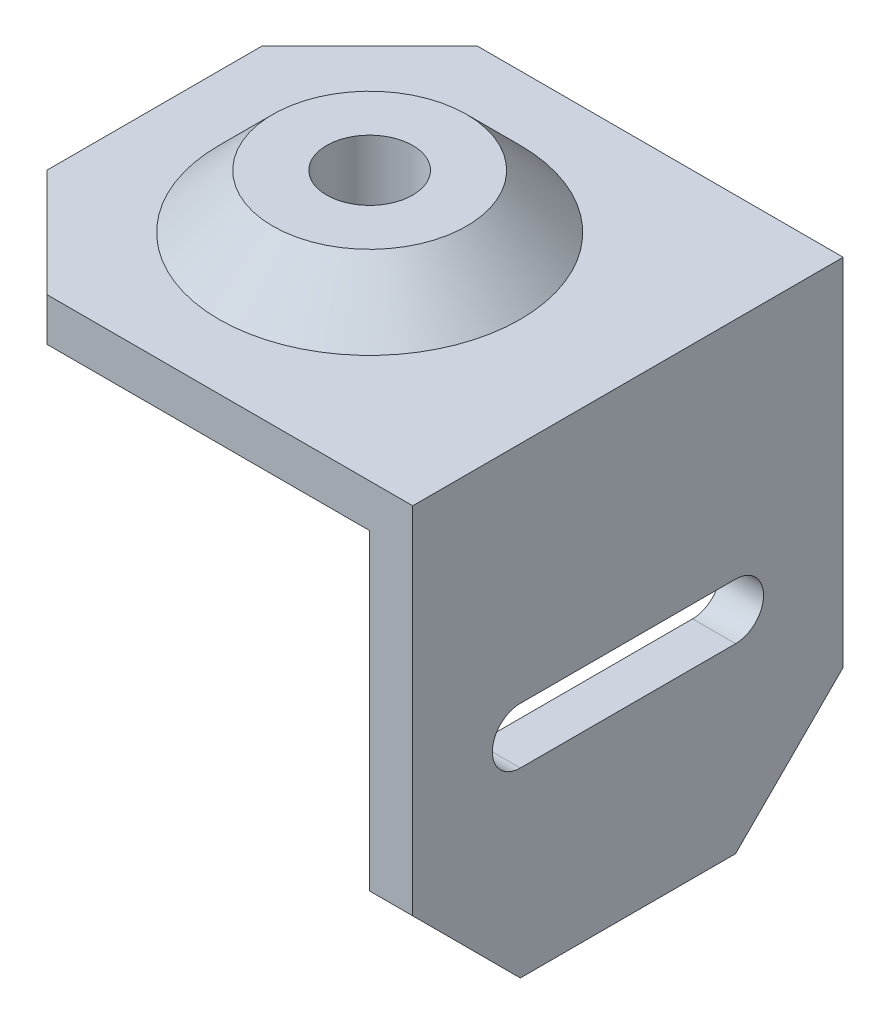
ISO-10303-21;
HEADER;
FILE_DESCRIPTION(('STEP AP214'),'2;1');
FILE_NAME('part.step','',(''),(''),'','','');
FILE_SCHEMA(('AUTOMOTIVE_DESIGN { 1 0 10303 214 1 1 1 1 }'));
ENDSEC;
DATA;
#1=APPLICATION_CONTEXT('core data for automotive mechanical design processes');
#2=APPLICATION_PROTOCOL_DEFINITION('international standard','automotive_design',2000,#1);
#3=PRODUCT_CONTEXT('',#1,'mechanical');
#4=PRODUCT('Part','Part','',(#3));
#5=PRODUCT_RELATED_PRODUCT_CATEGORY('part','',(#4));
#6=PRODUCT_DEFINITION_FORMATION('','',#4);
#7=PRODUCT_DEFINITION_CONTEXT('part definition',#1,'design');
#8=PRODUCT_DEFINITION('design','',#6,#7);
#9=PRODUCT_DEFINITION_SHAPE('','',#8);
#10=(LENGTH_UNIT() NAMED_UNIT(*) SI_UNIT(.MILLI.,.METRE.));
#11=(NAMED_UNIT(*) PLANE_ANGLE_UNIT() SI_UNIT($,.RADIAN.));
#12=(NAMED_UNIT(*) SI_UNIT($,.STERADIAN.) SOLID_ANGLE_UNIT());
#13=UNCERTAINTY_MEASURE_WITH_UNIT(LENGTH_MEASURE(1.E-05),#10,'distance_accuracy_value','');
#14=(GEOMETRIC_REPRESENTATION_CONTEXT(3) GLOBAL_UNCERTAINTY_ASSIGNED_CONTEXT((#13)) GLOBAL_UNIT_ASSIGNED_CONTEXT((#10,
#11,#12)) REPRESENTATION_CONTEXT('',''));
#15=CARTESIAN_POINT('',(0.,0.,0.));
#16=DIRECTION('',(0.,0.,1.));
#17=DIRECTION('',(1.,0.,0.));
#18=AXIS2_PLACEMENT_3D('',#15,#16,#17);
#19=CARTESIAN_POINT('',(0.,4.,0.));
#20=DIRECTION('',(0.,1.,0.));
#21=DIRECTION('',(0.,0.,1.));
#22=AXIS2_PLACEMENT_3D('',#19,#20,#21);
#23=PLANE('',#22);
#24=CARTESIAN_POINT('',(0.,4.,0.));
#25=DIRECTION('',(0.,1.,0.));
#26=DIRECTION('',(0.,0.,1.));
#27=AXIS2_PLACEMENT_3D('',#24,#25,#26);
#28=CIRCLE('',#27,14.);
#29=CARTESIAN_POINT('',(0.,4.,14.));
#30=VERTEX_POINT('',#29);
#31=EDGE_CURVE('E215',#30,#30,#28,.F.);
#32=ORIENTED_EDGE('',*,*,#31,.T.);
#33=EDGE_LOOP('',(#32));
#34=FACE_BOUND('',#33,.T.);
#35=DIRECTION('',(-1.,0.,0.));
#36=VECTOR('',#35,1.);
#37=CARTESIAN_POINT('',(-20.,4.,-20.));
#38=LINE('',#37,#36);
#39=CARTESIAN_POINT('',(24.,4.,-20.));
#40=VERTEX_POINT('',#39);
#41=CARTESIAN_POINT('',(-9.99999999999995,4.,-20.));
#42=VERTEX_POINT('',#41);
#43=EDGE_CURVE('E208',#40,#42,#38,.T.);
#44=ORIENTED_EDGE('',*,*,#43,.T.);
#45=DIRECTION('',(0.707106781186549,0.,-0.707106781186546));
#46=VECTOR('',#45,1.);
#47=CARTESIAN_POINT('',(-15.,4.,-15.));
#48=LINE('',#47,#46);
#49=CARTESIAN_POINT('',(-20.,4.,-10.));
#50=VERTEX_POINT('',#49);
#51=EDGE_CURVE('E11',#42,#50,#48,.F.);
#52=ORIENTED_EDGE('',*,*,#51,.T.);
#53=DIRECTION('',(0.,0.,1.));
#54=VECTOR('',#53,1.);
#55=CARTESIAN_POINT('',(-20.,4.,-20.));
#56=LINE('',#55,#54);
#57=CARTESIAN_POINT('',(-20.,4.,9.99999999999997));
#58=VERTEX_POINT('',#57);
#59=EDGE_CURVE('E210',#50,#58,#56,.T.);
#60=ORIENTED_EDGE('',*,*,#59,.T.);
#61=DIRECTION('',(-0.707106781186546,0.,-0.707106781186549));
#62=VECTOR('',#61,1.);
#63=CARTESIAN_POINT('',(-15.,4.,15.));
#64=LINE('',#63,#62);
#65=CARTESIAN_POINT('',(-10.,4.,20.));
#66=VERTEX_POINT('',#65);
#67=EDGE_CURVE('E41',#58,#66,#64,.F.);
#68=ORIENTED_EDGE('',*,*,#67,.T.);
#69=DIRECTION('',(1.,0.,0.));
#70=VECTOR('',#69,1.);
#71=CARTESIAN_POINT('',(-20.,4.,20.));
#72=LINE('',#71,#70);
#73=CARTESIAN_POINT('',(24.,4.,20.));
#74=VERTEX_POINT('',#73);
#75=EDGE_CURVE('E213',#66,#74,#72,.T.);
#76=ORIENTED_EDGE('',*,*,#75,.T.);
#77=DIRECTION('',(0.,0.,1.));
#78=VECTOR('',#77,1.);
#79=CARTESIAN_POINT('',(24.,4.,20.));
#80=LINE('',#79,#78);
#81=EDGE_CURVE('E189',#40,#74,#80,.T.);
#82=ORIENTED_EDGE('',*,*,#81,.F.);
#83=EDGE_LOOP('',(#44,#52,#60,#68,#76,#82));
#84=FACE_BOUND('',#83,.T.);
#85=ADVANCED_FACE('F33',(#34,#84),#23,.T.);
#86=CARTESIAN_POINT('',(0.,0.,0.));
#87=DIRECTION('',(0.,1.,0.));
#88=DIRECTION('',(0.,0.,1.));
#89=AXIS2_PLACEMENT_3D('',#86,#87,#88);
#90=PLANE('',#89);
#91=DIRECTION('',(0.,0.,1.));
#92=VECTOR('',#91,1.);
#93=CARTESIAN_POINT('',(-20.,0.,-20.));
#94=LINE('',#93,#92);
#95=CARTESIAN_POINT('',(-20.,0.,-10.));
#96=VERTEX_POINT('',#95);
#97=CARTESIAN_POINT('',(-20.,0.,9.99999999999997));
#98=VERTEX_POINT('',#97);
#99=EDGE_CURVE('E221',#96,#98,#94,.T.);
#100=ORIENTED_EDGE('',*,*,#99,.F.);
#101=DIRECTION('',(-0.707106781186549,0.,0.707106781186546));
#102=VECTOR('',#101,1.);
#103=CARTESIAN_POINT('',(-20.,0.,-10.));
#104=LINE('',#103,#102);
#105=CARTESIAN_POINT('',(-9.99999999999995,0.,-20.));
#106=VERTEX_POINT('',#105);
#107=EDGE_CURVE('E255',#96,#106,#104,.F.);
#108=ORIENTED_EDGE('',*,*,#107,.T.);
#109=DIRECTION('',(-1.,0.,0.));
#110=VECTOR('',#109,1.);
#111=CARTESIAN_POINT('',(-20.,0.,-20.));
#112=LINE('',#111,#110);
#113=CARTESIAN_POINT('',(20.,0.,-20.));
#114=VERTEX_POINT('',#113);
#115=EDGE_CURVE('E218',#114,#106,#112,.T.);
#116=ORIENTED_EDGE('',*,*,#115,.F.);
#117=DIRECTION('',(0.,0.,-1.));
#118=VECTOR('',#117,1.);
#119=CARTESIAN_POINT('',(20.,0.,-20.));
#120=LINE('',#119,#118);
#121=CARTESIAN_POINT('',(20.,0.,20.));
#122=VERTEX_POINT('',#121);
#123=EDGE_CURVE('E207',#122,#114,#120,.T.);
#124=ORIENTED_EDGE('',*,*,#123,.F.);
#125=DIRECTION('',(1.,0.,0.));
#126=VECTOR('',#125,1.);
#127=CARTESIAN_POINT('',(-20.,0.,20.));
#128=LINE('',#127,#126);
#129=CARTESIAN_POINT('',(-10.,0.,20.));
#130=VERTEX_POINT('',#129);
#131=EDGE_CURVE('E211',#130,#122,#128,.T.);
#132=ORIENTED_EDGE('',*,*,#131,.F.);
#133=DIRECTION('',(0.707106781186546,0.,0.707106781186549));
#134=VECTOR('',#133,1.);
#135=CARTESIAN_POINT('',(-10.,0.,20.));
#136=LINE('',#135,#134);
#137=EDGE_CURVE('E253',#130,#98,#136,.F.);
#138=ORIENTED_EDGE('',*,*,#137,.T.);
#139=EDGE_LOOP('',(#100,#108,#116,#124,#132,#138));
#140=FACE_BOUND('',#139,.T.);
#141=CARTESIAN_POINT('',(0.,0.,0.));
#142=DIRECTION('',(0.,1.,0.));
#143=DIRECTION('',(0.,0.,1.));
#144=AXIS2_PLACEMENT_3D('',#141,#142,#143);
#145=CIRCLE('',#144,4.);
#146=CARTESIAN_POINT('',(0.,0.,3.99999999999999));
#147=VERTEX_POINT('',#146);
#148=EDGE_CURVE('E204',#147,#147,#145,.T.);
#149=ORIENTED_EDGE('',*,*,#148,.T.);
#150=EDGE_LOOP('',(#149));
#151=FACE_BOUND('',#150,.T.);
#152=ADVANCED_FACE('F267',(#140,#151),#90,.F.);
#153=CARTESIAN_POINT('',(-20.,4.,-20.));
#154=DIRECTION('',(0.,0.,1.));
#155=DIRECTION('',(1.,0.,0.));
#156=AXIS2_PLACEMENT_3D('',#153,#154,#155);
#157=PLANE('',#156);
#158=DIRECTION('',(0.,1.,0.));
#159=VECTOR('',#158,1.);
#160=CARTESIAN_POINT('',(24.,4.,-20.));
#161=LINE('',#160,#159);
#162=CARTESIAN_POINT('',(24.,-29.,-20.));
#163=VERTEX_POINT('',#162);
#164=EDGE_CURVE('E187',#163,#40,#161,.T.);
#165=ORIENTED_EDGE('',*,*,#164,.F.);
#166=DIRECTION('',(-1.,0.,0.));
#167=VECTOR('',#166,1.);
#168=CARTESIAN_POINT('',(-20.,-29.,-20.));
#169=LINE('',#168,#167);
#170=CARTESIAN_POINT('',(20.,-29.,-20.));
#171=VERTEX_POINT('',#170);
#172=EDGE_CURVE('E228',#163,#171,#169,.T.);
#173=ORIENTED_EDGE('',*,*,#172,.T.);
#174=DIRECTION('',(0.,1.,0.));
#175=VECTOR('',#174,1.);
#176=CARTESIAN_POINT('',(20.,4.,-20.));
#177=LINE('',#176,#175);
#178=EDGE_CURVE('E184',#171,#114,#177,.T.);
#179=ORIENTED_EDGE('',*,*,#178,.T.);
#180=ORIENTED_EDGE('',*,*,#115,.T.);
#181=DIRECTION('',(0.,1.,0.));
#182=VECTOR('',#181,1.);
#183=CARTESIAN_POINT('',(-9.99999999999995,4.,-20.));
#184=LINE('',#183,#182);
#185=EDGE_CURVE('E226',#106,#42,#184,.T.);
#186=ORIENTED_EDGE('',*,*,#185,.T.);
#187=ORIENTED_EDGE('',*,*,#43,.F.);
#188=EDGE_LOOP('',(#165,#173,#179,#180,#186,#187));
#189=FACE_BOUND('',#188,.T.);
#190=ADVANCED_FACE('F278',(#189),#157,.F.);
#191=CARTESIAN_POINT('',(-20.,4.,-20.));
#192=DIRECTION('',(1.,0.,0.));
#193=DIRECTION('',(0.,0.,-1.));
#194=AXIS2_PLACEMENT_3D('',#191,#192,#193);
#195=PLANE('',#194);
#196=ORIENTED_EDGE('',*,*,#59,.F.);
#197=DIRECTION('',(0.,-1.,0.));
#198=VECTOR('',#197,1.);
#199=CARTESIAN_POINT('',(-20.,4.,-10.));
#200=LINE('',#199,#198);
#201=EDGE_CURVE('E250',#50,#96,#200,.T.);
#202=ORIENTED_EDGE('',*,*,#201,.T.);
#203=ORIENTED_EDGE('',*,*,#99,.T.);
#204=DIRECTION('',(0.,1.,0.));
#205=VECTOR('',#204,1.);
#206=CARTESIAN_POINT('',(-20.,4.,9.99999999999997));
#207=LINE('',#206,#205);
#208=EDGE_CURVE('E48',#98,#58,#207,.T.);
#209=ORIENTED_EDGE('',*,*,#208,.T.);
#210=EDGE_LOOP('',(#196,#202,#203,#209));
#211=FACE_BOUND('',#210,.T.);
#212=ADVANCED_FACE('F270',(#211),#195,.F.);
#213=CARTESIAN_POINT('',(-20.,4.,20.));
#214=DIRECTION('',(0.,0.,-1.));
#215=DIRECTION('',(-1.,0.,0.));
#216=AXIS2_PLACEMENT_3D('',#213,#214,#215);
#217=PLANE('',#216);
#218=DIRECTION('',(0.,-1.,0.));
#219=VECTOR('',#218,1.);
#220=CARTESIAN_POINT('',(20.,4.,20.));
#221=LINE('',#220,#219);
#222=CARTESIAN_POINT('',(20.,-28.9999999999999,20.));
#223=VERTEX_POINT('',#222);
#224=EDGE_CURVE('E179',#122,#223,#221,.T.);
#225=ORIENTED_EDGE('',*,*,#224,.T.);
#226=DIRECTION('',(1.,0.,0.));
#227=VECTOR('',#226,1.);
#228=CARTESIAN_POINT('',(-20.,-28.9999999999999,20.));
#229=LINE('',#228,#227);
#230=CARTESIAN_POINT('',(24.,-28.9999999999999,20.));
#231=VERTEX_POINT('',#230);
#232=EDGE_CURVE('E247',#223,#231,#229,.T.);
#233=ORIENTED_EDGE('',*,*,#232,.T.);
#234=DIRECTION('',(0.,-1.,0.));
#235=VECTOR('',#234,1.);
#236=CARTESIAN_POINT('',(24.,4.,20.));
#237=LINE('',#236,#235);
#238=EDGE_CURVE('E180',#74,#231,#237,.T.);
#239=ORIENTED_EDGE('',*,*,#238,.F.);
#240=ORIENTED_EDGE('',*,*,#75,.F.);
#241=DIRECTION('',(0.,-1.,0.));
#242=VECTOR('',#241,1.);
#243=CARTESIAN_POINT('',(-10.,4.,20.));
#244=LINE('',#243,#242);
#245=EDGE_CURVE('E244',#66,#130,#244,.T.);
#246=ORIENTED_EDGE('',*,*,#245,.T.);
#247=ORIENTED_EDGE('',*,*,#131,.T.);
#248=EDGE_LOOP('',(#225,#233,#239,#240,#246,#247));
#249=FACE_BOUND('',#248,.T.);
#250=ADVANCED_FACE('F263',(#249),#217,.F.);
#251=CARTESIAN_POINT('',(0.,4.,0.));
#252=DIRECTION('',(0.,-1.,0.));
#253=DIRECTION('',(0.,0.,-1.));
#254=AXIS2_PLACEMENT_3D('',#251,#252,#253);
#255=CYLINDRICAL_SURFACE('',#254,4.);
#256=ORIENTED_EDGE('',*,*,#148,.F.);
#257=EDGE_LOOP('',(#256));
#258=FACE_BOUND('',#257,.T.);
#259=CARTESIAN_POINT('',(0.,9.,0.));
#260=DIRECTION('',(0.,1.,0.));
#261=DIRECTION('',(0.,0.,1.));
#262=AXIS2_PLACEMENT_3D('',#259,#260,#261);
#263=CIRCLE('',#262,4.);
#264=CARTESIAN_POINT('',(0.,9.,3.99999999999999));
#265=VERTEX_POINT('',#264);
#266=EDGE_CURVE('E192',#265,#265,#263,.T.);
#267=ORIENTED_EDGE('',*,*,#266,.T.);
#268=EDGE_LOOP('',(#267));
#269=FACE_BOUND('',#268,.T.);
#270=ADVANCED_FACE('F316',(#258,#269),#255,.F.);
#271=CARTESIAN_POINT('',(0.,9.,0.));
#272=DIRECTION('',(0.,1.,0.));
#273=DIRECTION('',(0.,0.,1.));
#274=AXIS2_PLACEMENT_3D('',#271,#272,#273);
#275=PLANE('',#274);
#276=CARTESIAN_POINT('',(0.,9.,0.));
#277=DIRECTION('',(0.,1.,0.));
#278=DIRECTION('',(0.,0.,1.));
#279=AXIS2_PLACEMENT_3D('',#276,#277,#278);
#280=CIRCLE('',#279,9.);
#281=CARTESIAN_POINT('',(0.,9.,8.99999999999999));
#282=VERTEX_POINT('',#281);
#283=EDGE_CURVE('E201',#282,#282,#280,.T.);
#284=ORIENTED_EDGE('',*,*,#283,.T.);
#285=EDGE_LOOP('',(#284));
#286=FACE_BOUND('',#285,.T.);
#287=ORIENTED_EDGE('',*,*,#266,.F.);
#288=EDGE_LOOP('',(#287));
#289=FACE_BOUND('',#288,.T.);
#290=ADVANCED_FACE('F343',(#286,#289),#275,.T.);
#291=CARTESIAN_POINT('',(20.,0.,0.));
#292=DIRECTION('',(1.,0.,0.));
#293=DIRECTION('',(0.,0.,-1.));
#294=AXIS2_PLACEMENT_3D('',#291,#292,#293);
#295=PLANE('',#294);
#296=DIRECTION('',(0.,0.,-1.));
#297=VECTOR('',#296,1.);
#298=CARTESIAN_POINT('',(20.,-22.1,0.));
#299=LINE('',#298,#297);
#300=CARTESIAN_POINT('',(20.,-22.1,9.99999999999999));
#301=VERTEX_POINT('',#300);
#302=CARTESIAN_POINT('',(20.,-22.1,-10.));
#303=VERTEX_POINT('',#302);
#304=EDGE_CURVE('E166',#301,#303,#299,.T.);
#305=ORIENTED_EDGE('',*,*,#304,.T.);
#306=CARTESIAN_POINT('',(20.,-19.5,-10.));
#307=DIRECTION('',(1.,0.,0.));
#308=DIRECTION('',(0.,0.,-1.));
#309=AXIS2_PLACEMENT_3D('',#306,#307,#308);
#310=CIRCLE('',#309,2.6);
#311=CARTESIAN_POINT('',(20.,-16.9,-10.));
#312=VERTEX_POINT('',#311);
#313=EDGE_CURVE('E142',#303,#312,#310,.T.);
#314=ORIENTED_EDGE('',*,*,#313,.T.);
#315=DIRECTION('',(0.,0.,1.));
#316=VECTOR('',#315,1.);
#317=CARTESIAN_POINT('',(20.,-16.9,0.));
#318=LINE('',#317,#316);
#319=CARTESIAN_POINT('',(20.,-16.9,9.99999999999999));
#320=VERTEX_POINT('',#319);
#321=EDGE_CURVE('E175',#312,#320,#318,.T.);
#322=ORIENTED_EDGE('',*,*,#321,.T.);
#323=CARTESIAN_POINT('',(20.,-19.5,9.99999999999999));
#324=DIRECTION('',(1.,0.,0.));
#325=DIRECTION('',(0.,0.,-1.));
#326=AXIS2_PLACEMENT_3D('',#323,#324,#325);
#327=CIRCLE('',#326,2.6);
#328=EDGE_CURVE('E172',#320,#301,#327,.T.);
#329=ORIENTED_EDGE('',*,*,#328,.T.);
#330=EDGE_LOOP('',(#305,#314,#322,#329));
#331=FACE_BOUND('',#330,.T.);
#332=ORIENTED_EDGE('',*,*,#178,.F.);
#333=DIRECTION('',(0.,0.707106781186546,-0.707106781186549));
#334=VECTOR('',#333,1.);
#335=CARTESIAN_POINT('',(20.,-29.,-20.));
#336=LINE('',#335,#334);
#337=CARTESIAN_POINT('',(20.,-39.,-9.99999999999997));
#338=VERTEX_POINT('',#337);
#339=EDGE_CURVE('E233',#171,#338,#336,.F.);
#340=ORIENTED_EDGE('',*,*,#339,.T.);
#341=DIRECTION('',(0.,0.,-1.));
#342=VECTOR('',#341,1.);
#343=CARTESIAN_POINT('',(20.,-39.,20.));
#344=LINE('',#343,#342);
#345=CARTESIAN_POINT('',(20.,-39.,9.99999999999998));
#346=VERTEX_POINT('',#345);
#347=EDGE_CURVE('E195',#346,#338,#344,.T.);
#348=ORIENTED_EDGE('',*,*,#347,.F.);
#349=DIRECTION('',(0.,-0.707106781186549,-0.707106781186546));
#350=VECTOR('',#349,1.);
#351=CARTESIAN_POINT('',(20.,-39.,9.99999999999998));
#352=LINE('',#351,#350);
#353=EDGE_CURVE('E231',#346,#223,#352,.F.);
#354=ORIENTED_EDGE('',*,*,#353,.T.);
#355=ORIENTED_EDGE('',*,*,#224,.F.);
#356=ORIENTED_EDGE('',*,*,#123,.T.);
#357=EDGE_LOOP('',(#332,#340,#348,#354,#355,#356));
#358=FACE_BOUND('',#357,.T.);
#359=ADVANCED_FACE('F283',(#331,#358),#295,.F.);
#360=CARTESIAN_POINT('',(24.,-39.,20.));
#361=DIRECTION('',(0.,1.,0.));
#362=DIRECTION('',(0.,0.,1.));
#363=AXIS2_PLACEMENT_3D('',#360,#361,#362);
#364=PLANE('',#363);
#365=ORIENTED_EDGE('',*,*,#347,.T.);
#366=DIRECTION('',(1.,0.,0.));
#367=VECTOR('',#366,1.);
#368=CARTESIAN_POINT('',(24.,-39.,-9.99999999999997));
#369=LINE('',#368,#367);
#370=CARTESIAN_POINT('',(24.,-39.,-9.99999999999997));
#371=VERTEX_POINT('',#370);
#372=EDGE_CURVE('E238',#338,#371,#369,.T.);
#373=ORIENTED_EDGE('',*,*,#372,.T.);
#374=DIRECTION('',(0.,0.,-1.));
#375=VECTOR('',#374,1.);
#376=CARTESIAN_POINT('',(24.,-39.,20.));
#377=LINE('',#376,#375);
#378=CARTESIAN_POINT('',(24.,-39.,9.99999999999998));
#379=VERTEX_POINT('',#378);
#380=EDGE_CURVE('E183',#379,#371,#377,.T.);
#381=ORIENTED_EDGE('',*,*,#380,.F.);
#382=DIRECTION('',(-1.,0.,0.));
#383=VECTOR('',#382,1.);
#384=CARTESIAN_POINT('',(24.,-39.,9.99999999999998));
#385=LINE('',#384,#383);
#386=EDGE_CURVE('E235',#379,#346,#385,.T.);
#387=ORIENTED_EDGE('',*,*,#386,.T.);
#388=EDGE_LOOP('',(#365,#373,#381,#387));
#389=FACE_BOUND('',#388,.T.);
#390=ADVANCED_FACE('F294',(#389),#364,.F.);
#391=CARTESIAN_POINT('',(24.,0.,0.));
#392=DIRECTION('',(1.,0.,0.));
#393=DIRECTION('',(0.,0.,-1.));
#394=AXIS2_PLACEMENT_3D('',#391,#392,#393);
#395=PLANE('',#394);
#396=CARTESIAN_POINT('',(24.,-19.5,-10.));
#397=DIRECTION('',(-1.,0.,0.));
#398=DIRECTION('',(0.,0.,1.));
#399=AXIS2_PLACEMENT_3D('',#396,#397,#398);
#400=CIRCLE('',#399,2.6);
#401=CARTESIAN_POINT('',(24.,-16.9,-10.));
#402=VERTEX_POINT('',#401);
#403=CARTESIAN_POINT('',(24.,-22.1,-10.));
#404=VERTEX_POINT('',#403);
#405=EDGE_CURVE('E139',#402,#404,#400,.T.);
#406=ORIENTED_EDGE('',*,*,#405,.T.);
#407=DIRECTION('',(0.,0.,1.));
#408=VECTOR('',#407,1.);
#409=CARTESIAN_POINT('',(24.,-22.1,-10.));
#410=LINE('',#409,#408);
#411=CARTESIAN_POINT('',(24.,-22.1,9.99999999999999));
#412=VERTEX_POINT('',#411);
#413=EDGE_CURVE('E150',#404,#412,#410,.T.);
#414=ORIENTED_EDGE('',*,*,#413,.T.);
#415=CARTESIAN_POINT('',(24.,-19.5,9.99999999999999));
#416=DIRECTION('',(-1.,0.,0.));
#417=DIRECTION('',(0.,0.,1.));
#418=AXIS2_PLACEMENT_3D('',#415,#416,#417);
#419=CIRCLE('',#418,2.6);
#420=CARTESIAN_POINT('',(24.,-16.9,9.99999999999999));
#421=VERTEX_POINT('',#420);
#422=EDGE_CURVE('E155',#412,#421,#419,.T.);
#423=ORIENTED_EDGE('',*,*,#422,.T.);
#424=DIRECTION('',(0.,0.,-1.));
#425=VECTOR('',#424,1.);
#426=CARTESIAN_POINT('',(24.,-16.9,-10.));
#427=LINE('',#426,#425);
#428=EDGE_CURVE('E146',#421,#402,#427,.T.);
#429=ORIENTED_EDGE('',*,*,#428,.T.);
#430=EDGE_LOOP('',(#406,#414,#423,#429));
#431=FACE_BOUND('',#430,.T.);
#432=ORIENTED_EDGE('',*,*,#380,.T.);
#433=DIRECTION('',(0.,-0.707106781186546,0.707106781186549));
#434=VECTOR('',#433,1.);
#435=CARTESIAN_POINT('',(24.,-24.5000000000001,-24.5));
#436=LINE('',#435,#434);
#437=EDGE_CURVE('E242',#371,#163,#436,.F.);
#438=ORIENTED_EDGE('',*,*,#437,.T.);
#439=ORIENTED_EDGE('',*,*,#164,.T.);
#440=ORIENTED_EDGE('',*,*,#81,.T.);
#441=ORIENTED_EDGE('',*,*,#238,.T.);
#442=DIRECTION('',(0.,0.707106781186549,0.707106781186546));
#443=VECTOR('',#442,1.);
#444=CARTESIAN_POINT('',(24.,-24.4999999999999,24.5));
#445=LINE('',#444,#443);
#446=EDGE_CURVE('E240',#231,#379,#445,.F.);
#447=ORIENTED_EDGE('',*,*,#446,.T.);
#448=EDGE_LOOP('',(#432,#438,#439,#440,#441,#447));
#449=FACE_BOUND('',#448,.T.);
#450=ADVANCED_FACE('F157',(#431,#449),#395,.T.);
#451=CARTESIAN_POINT('',(24.,-19.5,-10.));
#452=DIRECTION('',(-1.,0.,0.));
#453=DIRECTION('',(0.,0.,1.));
#454=AXIS2_PLACEMENT_3D('',#451,#452,#453);
#455=CYLINDRICAL_SURFACE('',#454,2.6);
#456=DIRECTION('',(-1.,0.,0.));
#457=VECTOR('',#456,1.);
#458=CARTESIAN_POINT('',(24.,-22.1,-10.));
#459=LINE('',#458,#457);
#460=EDGE_CURVE('E134',#404,#303,#459,.T.);
#461=ORIENTED_EDGE('',*,*,#460,.F.);
#462=ORIENTED_EDGE('',*,*,#405,.F.);
#463=DIRECTION('',(-1.,0.,0.));
#464=VECTOR('',#463,1.);
#465=CARTESIAN_POINT('',(24.,-16.9,-10.));
#466=LINE('',#465,#464);
#467=EDGE_CURVE('E164',#402,#312,#466,.T.);
#468=ORIENTED_EDGE('',*,*,#467,.T.);
#469=ORIENTED_EDGE('',*,*,#313,.F.);
#470=EDGE_LOOP('',(#461,#462,#468,#469));
#471=FACE_BOUND('',#470,.T.);
#472=ADVANCED_FACE('F136',(#471),#455,.F.);
#473=CARTESIAN_POINT('',(24.,-16.9,-10.));
#474=DIRECTION('',(0.,1.,0.));
#475=DIRECTION('',(0.,0.,1.));
#476=AXIS2_PLACEMENT_3D('',#473,#474,#475);
#477=PLANE('',#476);
#478=ORIENTED_EDGE('',*,*,#467,.F.);
#479=ORIENTED_EDGE('',*,*,#428,.F.);
#480=DIRECTION('',(-1.,0.,0.));
#481=VECTOR('',#480,1.);
#482=CARTESIAN_POINT('',(24.,-16.9,9.99999999999999));
#483=LINE('',#482,#481);
#484=EDGE_CURVE('E167',#421,#320,#483,.T.);
#485=ORIENTED_EDGE('',*,*,#484,.T.);
#486=ORIENTED_EDGE('',*,*,#321,.F.);
#487=EDGE_LOOP('',(#478,#479,#485,#486));
#488=FACE_BOUND('',#487,.T.);
#489=ADVANCED_FACE('F374',(#488),#477,.F.);
#490=CARTESIAN_POINT('',(24.,-19.5,9.99999999999999));
#491=DIRECTION('',(-1.,0.,0.));
#492=DIRECTION('',(0.,0.,1.));
#493=AXIS2_PLACEMENT_3D('',#490,#491,#492);
#494=CYLINDRICAL_SURFACE('',#493,2.6);
#495=ORIENTED_EDGE('',*,*,#484,.F.);
#496=ORIENTED_EDGE('',*,*,#422,.F.);
#497=DIRECTION('',(-1.,0.,0.));
#498=VECTOR('',#497,1.);
#499=CARTESIAN_POINT('',(24.,-22.1,9.99999999999999));
#500=LINE('',#499,#498);
#501=EDGE_CURVE('E145',#412,#301,#500,.T.);
#502=ORIENTED_EDGE('',*,*,#501,.T.);
#503=ORIENTED_EDGE('',*,*,#328,.F.);
#504=EDGE_LOOP('',(#495,#496,#502,#503));
#505=FACE_BOUND('',#504,.T.);
#506=ADVANCED_FACE('F381',(#505),#494,.F.);
#507=CARTESIAN_POINT('',(24.,-22.1,-10.));
#508=DIRECTION('',(0.,-1.,0.));
#509=DIRECTION('',(0.,0.,-1.));
#510=AXIS2_PLACEMENT_3D('',#507,#508,#509);
#511=PLANE('',#510);
#512=ORIENTED_EDGE('',*,*,#501,.F.);
#513=ORIENTED_EDGE('',*,*,#413,.F.);
#514=ORIENTED_EDGE('',*,*,#460,.T.);
#515=ORIENTED_EDGE('',*,*,#304,.F.);
#516=EDGE_LOOP('',(#512,#513,#514,#515));
#517=FACE_BOUND('',#516,.T.);
#518=ADVANCED_FACE('F151',(#517),#511,.F.);
#519=CARTESIAN_POINT('',(0.,9.00000000000001,0.));
#520=DIRECTION('',(0.,-1.,0.));
#521=DIRECTION('',(0.,0.,-1.));
#522=AXIS2_PLACEMENT_3D('',#519,#520,#521);
#523=CONICAL_SURFACE('',#522,9.,0.785398163397443);
#524=ORIENTED_EDGE('',*,*,#31,.F.);
#525=EDGE_LOOP('',(#524));
#526=FACE_BOUND('',#525,.T.);
#527=ORIENTED_EDGE('',*,*,#283,.F.);
#528=EDGE_LOOP('',(#527));
#529=FACE_BOUND('',#528,.T.);
#530=ADVANCED_FACE('F299',(#526,#529),#523,.T.);
#531=CARTESIAN_POINT('',(-20.,-29.,-20.));
#532=DIRECTION('',(0.,0.707106781186549,0.707106781186546));
#533=DIRECTION('',(-1.,0.,0.));
#534=AXIS2_PLACEMENT_3D('',#531,#532,#533);
#535=PLANE('',#534);
#536=ORIENTED_EDGE('',*,*,#437,.F.);
#537=ORIENTED_EDGE('',*,*,#372,.F.);
#538=ORIENTED_EDGE('',*,*,#339,.F.);
#539=ORIENTED_EDGE('',*,*,#172,.F.);
#540=EDGE_LOOP('',(#536,#537,#538,#539));
#541=FACE_BOUND('',#540,.T.);
#542=ADVANCED_FACE('F297',(#541),#535,.F.);
#543=CARTESIAN_POINT('',(24.,-39.,9.99999999999998));
#544=DIRECTION('',(0.,0.707106781186546,-0.707106781186549));
#545=DIRECTION('',(-1.,0.,0.));
#546=AXIS2_PLACEMENT_3D('',#543,#544,#545);
#547=PLANE('',#546);
#548=ORIENTED_EDGE('',*,*,#446,.F.);
#549=ORIENTED_EDGE('',*,*,#232,.F.);
#550=ORIENTED_EDGE('',*,*,#353,.F.);
#551=ORIENTED_EDGE('',*,*,#386,.F.);
#552=EDGE_LOOP('',(#548,#549,#550,#551));
#553=FACE_BOUND('',#552,.T.);
#554=ADVANCED_FACE('F289',(#553),#547,.F.);
#555=CARTESIAN_POINT('',(-20.,4.,-10.));
#556=DIRECTION('',(0.707106781186546,0.,0.707106781186549));
#557=DIRECTION('',(0.,-1.,0.));
#558=AXIS2_PLACEMENT_3D('',#555,#556,#557);
#559=PLANE('',#558);
#560=ORIENTED_EDGE('',*,*,#51,.F.);
#561=ORIENTED_EDGE('',*,*,#185,.F.);
#562=ORIENTED_EDGE('',*,*,#107,.F.);
#563=ORIENTED_EDGE('',*,*,#201,.F.);
#564=EDGE_LOOP('',(#560,#561,#562,#563));
#565=FACE_BOUND('',#564,.T.);
#566=ADVANCED_FACE('F273',(#565),#559,.F.);
#567=CARTESIAN_POINT('',(-10.,4.,20.));
#568=DIRECTION('',(0.707106781186549,0.,-0.707106781186546));
#569=DIRECTION('',(0.,-1.,0.));
#570=AXIS2_PLACEMENT_3D('',#567,#568,#569);
#571=PLANE('',#570);
#572=ORIENTED_EDGE('',*,*,#67,.F.);
#573=ORIENTED_EDGE('',*,*,#208,.F.);
#574=ORIENTED_EDGE('',*,*,#137,.F.);
#575=ORIENTED_EDGE('',*,*,#245,.F.);
#576=EDGE_LOOP('',(#572,#573,#574,#575));
#577=FACE_BOUND('',#576,.T.);
#578=ADVANCED_FACE('F35',(#577),#571,.F.);
#579=CLOSED_SHELL('',(#85,#152,#190,#212,#250,#270,#290,#359,#390,#450,#472,#489,#506,#518,#530,
#542,#554,#566,#578));
#580=MANIFOLD_SOLID_BREP('B2',#579);
#581=ADVANCED_BREP_SHAPE_REPRESENTATION('',(#18,#580),#14);
#582=SHAPE_DEFINITION_REPRESENTATION(#9,#581);
ENDSEC;
END-ISO-10303-21;
